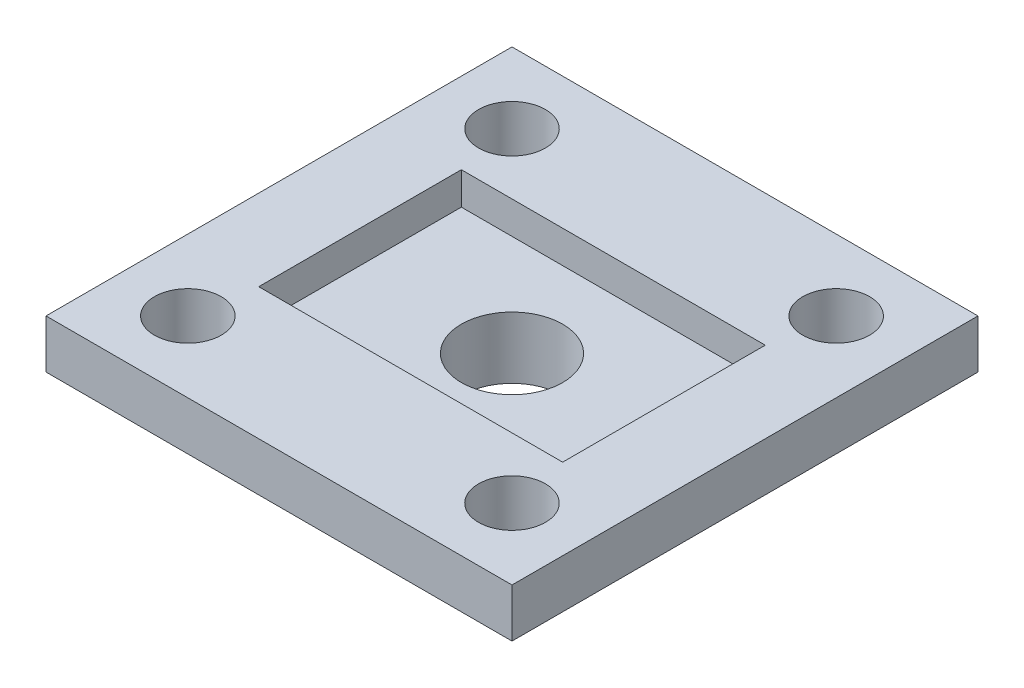
ISO-10303-21;
HEADER;
FILE_DESCRIPTION(('STEP AP214'),'2;1');
FILE_NAME('part.step','',(''),(''),'','','');
FILE_SCHEMA(('AUTOMOTIVE_DESIGN { 1 0 10303 214 1 1 1 1 }'));
ENDSEC;
DATA;
#1=APPLICATION_CONTEXT('core data for automotive mechanical design processes');
#2=APPLICATION_PROTOCOL_DEFINITION('international standard','automotive_design',2000,#1);
#3=PRODUCT_CONTEXT('',#1,'mechanical');
#4=PRODUCT('Part','Part','',(#3));
#5=PRODUCT_RELATED_PRODUCT_CATEGORY('part','',(#4));
#6=PRODUCT_DEFINITION_FORMATION('','',#4);
#7=PRODUCT_DEFINITION_CONTEXT('part definition',#1,'design');
#8=PRODUCT_DEFINITION('design','',#6,#7);
#9=PRODUCT_DEFINITION_SHAPE('','',#8);
#10=(LENGTH_UNIT() NAMED_UNIT(*) SI_UNIT(.MILLI.,.METRE.));
#11=(NAMED_UNIT(*) PLANE_ANGLE_UNIT() SI_UNIT($,.RADIAN.));
#12=(NAMED_UNIT(*) SI_UNIT($,.STERADIAN.) SOLID_ANGLE_UNIT());
#13=UNCERTAINTY_MEASURE_WITH_UNIT(LENGTH_MEASURE(1.E-05),#10,'distance_accuracy_value','');
#14=(GEOMETRIC_REPRESENTATION_CONTEXT(3) GLOBAL_UNCERTAINTY_ASSIGNED_CONTEXT((#13)) GLOBAL_UNIT_ASSIGNED_CONTEXT((#10,
#11,#12)) REPRESENTATION_CONTEXT('',''));
#15=CARTESIAN_POINT('',(0.,0.,0.));
#16=DIRECTION('',(0.,0.,1.));
#17=DIRECTION('',(1.,0.,0.));
#18=AXIS2_PLACEMENT_3D('',#15,#16,#17);
#19=CARTESIAN_POINT('',(0.,0.,0.));
#20=DIRECTION('',(0.,-1.,0.));
#21=DIRECTION('',(0.,0.,-1.));
#22=AXIS2_PLACEMENT_3D('',#19,#20,#21);
#23=PLANE('',#22);
#24=CARTESIAN_POINT('',(8.,0.,-8.00000000000001));
#25=DIRECTION('',(0.,1.,0.));
#26=DIRECTION('',(0.,0.,-1.));
#27=AXIS2_PLACEMENT_3D('',#24,#25,#26);
#28=CIRCLE('',#27,1.65);
#29=CARTESIAN_POINT('',(8.,0.,-9.65000000000001));
#30=VERTEX_POINT('',#29);
#31=EDGE_CURVE('E155',#30,#30,#28,.T.);
#32=ORIENTED_EDGE('',*,*,#31,.T.);
#33=EDGE_LOOP('',(#32));
#34=FACE_BOUND('',#33,.T.);
#35=CARTESIAN_POINT('',(8.,0.,8.));
#36=DIRECTION('',(0.,1.,0.));
#37=DIRECTION('',(0.,0.,-1.));
#38=AXIS2_PLACEMENT_3D('',#35,#36,#37);
#39=CIRCLE('',#38,1.65);
#40=CARTESIAN_POINT('',(8.,0.,6.34999999999999));
#41=VERTEX_POINT('',#40);
#42=EDGE_CURVE('E161',#41,#41,#39,.T.);
#43=ORIENTED_EDGE('',*,*,#42,.T.);
#44=EDGE_LOOP('',(#43));
#45=FACE_BOUND('',#44,.T.);
#46=DIRECTION('',(0.,0.,-1.));
#47=VECTOR('',#46,1.);
#48=CARTESIAN_POINT('',(11.5,0.,11.5));
#49=LINE('',#48,#47);
#50=CARTESIAN_POINT('',(11.5,0.,11.5));
#51=VERTEX_POINT('',#50);
#52=CARTESIAN_POINT('',(11.5,0.,-11.5));
#53=VERTEX_POINT('',#52);
#54=EDGE_CURVE('E173',#51,#53,#49,.T.);
#55=ORIENTED_EDGE('',*,*,#54,.F.);
#56=DIRECTION('',(1.,0.,0.));
#57=VECTOR('',#56,1.);
#58=CARTESIAN_POINT('',(-11.5,0.,11.5));
#59=LINE('',#58,#57);
#60=CARTESIAN_POINT('',(-11.5,0.,11.5));
#61=VERTEX_POINT('',#60);
#62=EDGE_CURVE('E79',#61,#51,#59,.T.);
#63=ORIENTED_EDGE('',*,*,#62,.F.);
#64=DIRECTION('',(0.,0.,1.));
#65=VECTOR('',#64,1.);
#66=CARTESIAN_POINT('',(-11.5,0.,11.5));
#67=LINE('',#66,#65);
#68=CARTESIAN_POINT('',(-11.5,0.,-11.5));
#69=VERTEX_POINT('',#68);
#70=EDGE_CURVE('E187',#69,#61,#67,.T.);
#71=ORIENTED_EDGE('',*,*,#70,.F.);
#72=DIRECTION('',(-1.,0.,0.));
#73=VECTOR('',#72,1.);
#74=CARTESIAN_POINT('',(-11.5,0.,-11.5));
#75=LINE('',#74,#73);
#76=EDGE_CURVE('E185',#53,#69,#75,.T.);
#77=ORIENTED_EDGE('',*,*,#76,.F.);
#78=EDGE_LOOP('',(#55,#63,#71,#77));
#79=FACE_BOUND('',#78,.T.);
#80=CARTESIAN_POINT('',(-8.,0.,-8.));
#81=DIRECTION('',(0.,1.,0.));
#82=DIRECTION('',(0.,0.,1.));
#83=AXIS2_PLACEMENT_3D('',#80,#81,#82);
#84=CIRCLE('',#83,1.65);
#85=CARTESIAN_POINT('',(-8.,0.,-6.35));
#86=VERTEX_POINT('',#85);
#87=EDGE_CURVE('E167',#86,#86,#84,.T.);
#88=ORIENTED_EDGE('',*,*,#87,.T.);
#89=EDGE_LOOP('',(#88));
#90=FACE_BOUND('',#89,.T.);
#91=CARTESIAN_POINT('',(-8.,0.,8.));
#92=DIRECTION('',(0.,1.,0.));
#93=DIRECTION('',(0.,0.,1.));
#94=AXIS2_PLACEMENT_3D('',#91,#92,#93);
#95=CIRCLE('',#94,1.65);
#96=CARTESIAN_POINT('',(-8.,0.,9.65));
#97=VERTEX_POINT('',#96);
#98=EDGE_CURVE('E154',#97,#97,#95,.T.);
#99=ORIENTED_EDGE('',*,*,#98,.T.);
#100=EDGE_LOOP('',(#99));
#101=FACE_BOUND('',#100,.T.);
#102=CARTESIAN_POINT('',(0.,0.,0.));
#103=DIRECTION('',(0.,-1.,0.));
#104=DIRECTION('',(0.,0.,-1.));
#105=AXIS2_PLACEMENT_3D('',#102,#103,#104);
#106=CIRCLE('',#105,3.5);
#107=CARTESIAN_POINT('',(0.,0.,-3.5));
#108=VERTEX_POINT('',#107);
#109=EDGE_CURVE('E135',#108,#108,#106,.T.);
#110=ORIENTED_EDGE('',*,*,#109,.F.);
#111=EDGE_LOOP('',(#110));
#112=FACE_BOUND('',#111,.T.);
#113=ADVANCED_FACE('F33',(#34,#45,#79,#90,#101,#112),#23,.T.);
#114=CARTESIAN_POINT('',(0.,2.4,0.));
#115=DIRECTION('',(0.,-1.,0.));
#116=DIRECTION('',(0.,0.,-1.));
#117=AXIS2_PLACEMENT_3D('',#114,#115,#116);
#118=PLANE('',#117);
#119=DIRECTION('',(-1.,0.,0.));
#120=VECTOR('',#119,1.);
#121=CARTESIAN_POINT('',(-7.5,2.4,-5.));
#122=LINE('',#121,#120);
#123=CARTESIAN_POINT('',(7.5,2.4,-5.));
#124=VERTEX_POINT('',#123);
#125=CARTESIAN_POINT('',(-7.5,2.4,-5.));
#126=VERTEX_POINT('',#125);
#127=EDGE_CURVE('E141',#124,#126,#122,.T.);
#128=ORIENTED_EDGE('',*,*,#127,.F.);
#129=DIRECTION('',(0.,0.,-1.));
#130=VECTOR('',#129,1.);
#131=CARTESIAN_POINT('',(7.5,2.4,5.));
#132=LINE('',#131,#130);
#133=CARTESIAN_POINT('',(7.5,2.4,5.));
#134=VERTEX_POINT('',#133);
#135=EDGE_CURVE('E49',#134,#124,#132,.T.);
#136=ORIENTED_EDGE('',*,*,#135,.F.);
#137=DIRECTION('',(1.,0.,0.));
#138=VECTOR('',#137,1.);
#139=CARTESIAN_POINT('',(-7.5,2.4,5.));
#140=LINE('',#139,#138);
#141=CARTESIAN_POINT('',(-7.5,2.4,5.));
#142=VERTEX_POINT('',#141);
#143=EDGE_CURVE('E129',#142,#134,#140,.T.);
#144=ORIENTED_EDGE('',*,*,#143,.F.);
#145=DIRECTION('',(0.,0.,1.));
#146=VECTOR('',#145,1.);
#147=CARTESIAN_POINT('',(-7.5,2.4,5.));
#148=LINE('',#147,#146);
#149=EDGE_CURVE('E132',#126,#142,#148,.T.);
#150=ORIENTED_EDGE('',*,*,#149,.F.);
#151=EDGE_LOOP('',(#128,#136,#144,#150));
#152=FACE_BOUND('',#151,.T.);
#153=DIRECTION('',(0.,0.,-1.));
#154=VECTOR('',#153,1.);
#155=CARTESIAN_POINT('',(11.5,2.4,11.5));
#156=LINE('',#155,#154);
#157=CARTESIAN_POINT('',(11.5,2.4,11.5));
#158=VERTEX_POINT('',#157);
#159=CARTESIAN_POINT('',(11.5,2.4,-11.5));
#160=VERTEX_POINT('',#159);
#161=EDGE_CURVE('E176',#158,#160,#156,.T.);
#162=ORIENTED_EDGE('',*,*,#161,.T.);
#163=DIRECTION('',(-1.,0.,0.));
#164=VECTOR('',#163,1.);
#165=CARTESIAN_POINT('',(-11.5,2.4,-11.5));
#166=LINE('',#165,#164);
#167=CARTESIAN_POINT('',(-11.5,2.4,-11.5));
#168=VERTEX_POINT('',#167);
#169=EDGE_CURVE('E86',#160,#168,#166,.T.);
#170=ORIENTED_EDGE('',*,*,#169,.T.);
#171=DIRECTION('',(0.,0.,1.));
#172=VECTOR('',#171,1.);
#173=CARTESIAN_POINT('',(-11.5,2.4,11.5));
#174=LINE('',#173,#172);
#175=CARTESIAN_POINT('',(-11.5,2.4,11.5));
#176=VERTEX_POINT('',#175);
#177=EDGE_CURVE('E179',#168,#176,#174,.T.);
#178=ORIENTED_EDGE('',*,*,#177,.T.);
#179=DIRECTION('',(1.,0.,0.));
#180=VECTOR('',#179,1.);
#181=CARTESIAN_POINT('',(-11.5,2.4,11.5));
#182=LINE('',#181,#180);
#183=EDGE_CURVE('E58',#176,#158,#182,.T.);
#184=ORIENTED_EDGE('',*,*,#183,.T.);
#185=EDGE_LOOP('',(#162,#170,#178,#184));
#186=FACE_BOUND('',#185,.T.);
#187=CARTESIAN_POINT('',(-8.,2.4,-8.));
#188=DIRECTION('',(0.,1.,0.));
#189=DIRECTION('',(0.,0.,1.));
#190=AXIS2_PLACEMENT_3D('',#187,#188,#189);
#191=CIRCLE('',#190,1.65);
#192=CARTESIAN_POINT('',(-8.,2.4,-6.35));
#193=VERTEX_POINT('',#192);
#194=EDGE_CURVE('E170',#193,#193,#191,.T.);
#195=ORIENTED_EDGE('',*,*,#194,.F.);
#196=EDGE_LOOP('',(#195));
#197=FACE_BOUND('',#196,.T.);
#198=CARTESIAN_POINT('',(8.,2.4,8.));
#199=DIRECTION('',(0.,1.,0.));
#200=DIRECTION('',(0.,0.,-1.));
#201=AXIS2_PLACEMENT_3D('',#198,#199,#200);
#202=CIRCLE('',#201,1.65);
#203=CARTESIAN_POINT('',(8.,2.4,6.34999999999999));
#204=VERTEX_POINT('',#203);
#205=EDGE_CURVE('E164',#204,#204,#202,.T.);
#206=ORIENTED_EDGE('',*,*,#205,.F.);
#207=EDGE_LOOP('',(#206));
#208=FACE_BOUND('',#207,.T.);
#209=CARTESIAN_POINT('',(-8.,2.4,8.));
#210=DIRECTION('',(0.,1.,0.));
#211=DIRECTION('',(0.,0.,1.));
#212=AXIS2_PLACEMENT_3D('',#209,#210,#211);
#213=CIRCLE('',#212,1.65);
#214=CARTESIAN_POINT('',(-8.,2.4,9.65));
#215=VERTEX_POINT('',#214);
#216=EDGE_CURVE('E158',#215,#215,#213,.T.);
#217=ORIENTED_EDGE('',*,*,#216,.F.);
#218=EDGE_LOOP('',(#217));
#219=FACE_BOUND('',#218,.T.);
#220=CARTESIAN_POINT('',(8.,2.4,-8.00000000000001));
#221=DIRECTION('',(0.,1.,0.));
#222=DIRECTION('',(0.,0.,-1.));
#223=AXIS2_PLACEMENT_3D('',#220,#221,#222);
#224=CIRCLE('',#223,1.65);
#225=CARTESIAN_POINT('',(8.,2.4,-9.65000000000001));
#226=VERTEX_POINT('',#225);
#227=EDGE_CURVE('E151',#226,#226,#224,.T.);
#228=ORIENTED_EDGE('',*,*,#227,.F.);
#229=EDGE_LOOP('',(#228));
#230=FACE_BOUND('',#229,.T.);
#231=ADVANCED_FACE('F220',(#152,#186,#197,#208,#219,#230),#118,.F.);
#232=CARTESIAN_POINT('',(11.5,2.4,11.5));
#233=DIRECTION('',(-1.,0.,0.));
#234=DIRECTION('',(0.,0.,1.));
#235=AXIS2_PLACEMENT_3D('',#232,#233,#234);
#236=PLANE('',#235);
#237=ORIENTED_EDGE('',*,*,#54,.T.);
#238=DIRECTION('',(0.,-1.,0.));
#239=VECTOR('',#238,1.);
#240=CARTESIAN_POINT('',(11.5,2.4,-11.5));
#241=LINE('',#240,#239);
#242=EDGE_CURVE('E11',#160,#53,#241,.T.);
#243=ORIENTED_EDGE('',*,*,#242,.F.);
#244=ORIENTED_EDGE('',*,*,#161,.F.);
#245=DIRECTION('',(0.,-1.,0.));
#246=VECTOR('',#245,1.);
#247=CARTESIAN_POINT('',(11.5,2.4,11.5));
#248=LINE('',#247,#246);
#249=EDGE_CURVE('E182',#158,#51,#248,.T.);
#250=ORIENTED_EDGE('',*,*,#249,.T.);
#251=EDGE_LOOP('',(#237,#243,#244,#250));
#252=FACE_BOUND('',#251,.T.);
#253=ADVANCED_FACE('F35',(#252),#236,.F.);
#254=CARTESIAN_POINT('',(-11.5,2.4,-11.5));
#255=DIRECTION('',(0.,0.,1.));
#256=DIRECTION('',(1.,0.,0.));
#257=AXIS2_PLACEMENT_3D('',#254,#255,#256);
#258=PLANE('',#257);
#259=ORIENTED_EDGE('',*,*,#76,.T.);
#260=DIRECTION('',(0.,-1.,0.));
#261=VECTOR('',#260,1.);
#262=CARTESIAN_POINT('',(-11.5,2.4,-11.5));
#263=LINE('',#262,#261);
#264=EDGE_CURVE('E42',#168,#69,#263,.T.);
#265=ORIENTED_EDGE('',*,*,#264,.F.);
#266=ORIENTED_EDGE('',*,*,#169,.F.);
#267=ORIENTED_EDGE('',*,*,#242,.T.);
#268=EDGE_LOOP('',(#259,#265,#266,#267));
#269=FACE_BOUND('',#268,.T.);
#270=ADVANCED_FACE('F216',(#269),#258,.F.);
#271=CARTESIAN_POINT('',(-11.5,2.4,11.5));
#272=DIRECTION('',(1.,0.,0.));
#273=DIRECTION('',(0.,0.,-1.));
#274=AXIS2_PLACEMENT_3D('',#271,#272,#273);
#275=PLANE('',#274);
#276=ORIENTED_EDGE('',*,*,#70,.T.);
#277=DIRECTION('',(0.,-1.,0.));
#278=VECTOR('',#277,1.);
#279=CARTESIAN_POINT('',(-11.5,2.4,11.5));
#280=LINE('',#279,#278);
#281=EDGE_CURVE('E191',#176,#61,#280,.T.);
#282=ORIENTED_EDGE('',*,*,#281,.F.);
#283=ORIENTED_EDGE('',*,*,#177,.F.);
#284=ORIENTED_EDGE('',*,*,#264,.T.);
#285=EDGE_LOOP('',(#276,#282,#283,#284));
#286=FACE_BOUND('',#285,.T.);
#287=ADVANCED_FACE('F197',(#286),#275,.F.);
#288=CARTESIAN_POINT('',(-11.5,2.4,11.5));
#289=DIRECTION('',(0.,0.,-1.));
#290=DIRECTION('',(-1.,0.,0.));
#291=AXIS2_PLACEMENT_3D('',#288,#289,#290);
#292=PLANE('',#291);
#293=ORIENTED_EDGE('',*,*,#62,.T.);
#294=ORIENTED_EDGE('',*,*,#249,.F.);
#295=ORIENTED_EDGE('',*,*,#183,.F.);
#296=ORIENTED_EDGE('',*,*,#281,.T.);
#297=EDGE_LOOP('',(#293,#294,#295,#296));
#298=FACE_BOUND('',#297,.T.);
#299=ADVANCED_FACE('F205',(#298),#292,.F.);
#300=CARTESIAN_POINT('',(-8.,2.4,-8.));
#301=DIRECTION('',(0.,-1.,0.));
#302=DIRECTION('',(0.,0.,-1.));
#303=AXIS2_PLACEMENT_3D('',#300,#301,#302);
#304=CYLINDRICAL_SURFACE('',#303,1.65);
#305=ORIENTED_EDGE('',*,*,#194,.T.);
#306=EDGE_LOOP('',(#305));
#307=FACE_BOUND('',#306,.T.);
#308=ORIENTED_EDGE('',*,*,#87,.F.);
#309=EDGE_LOOP('',(#308));
#310=FACE_BOUND('',#309,.T.);
#311=ADVANCED_FACE('F207',(#307,#310),#304,.F.);
#312=CARTESIAN_POINT('',(8.,2.4,8.));
#313=DIRECTION('',(0.,-1.,0.));
#314=DIRECTION('',(0.,0.,-1.));
#315=AXIS2_PLACEMENT_3D('',#312,#313,#314);
#316=CYLINDRICAL_SURFACE('',#315,1.65);
#317=ORIENTED_EDGE('',*,*,#205,.T.);
#318=EDGE_LOOP('',(#317));
#319=FACE_BOUND('',#318,.T.);
#320=ORIENTED_EDGE('',*,*,#42,.F.);
#321=EDGE_LOOP('',(#320));
#322=FACE_BOUND('',#321,.T.);
#323=ADVANCED_FACE('F213',(#319,#322),#316,.F.);
#324=CARTESIAN_POINT('',(-8.,2.4,8.));
#325=DIRECTION('',(0.,-1.,0.));
#326=DIRECTION('',(0.,0.,-1.));
#327=AXIS2_PLACEMENT_3D('',#324,#325,#326);
#328=CYLINDRICAL_SURFACE('',#327,1.65);
#329=ORIENTED_EDGE('',*,*,#216,.T.);
#330=EDGE_LOOP('',(#329));
#331=FACE_BOUND('',#330,.T.);
#332=ORIENTED_EDGE('',*,*,#98,.F.);
#333=EDGE_LOOP('',(#332));
#334=FACE_BOUND('',#333,.T.);
#335=ADVANCED_FACE('F231',(#331,#334),#328,.F.);
#336=CARTESIAN_POINT('',(8.,2.4,-8.00000000000001));
#337=DIRECTION('',(0.,-1.,0.));
#338=DIRECTION('',(0.,0.,-1.));
#339=AXIS2_PLACEMENT_3D('',#336,#337,#338);
#340=CYLINDRICAL_SURFACE('',#339,1.65);
#341=ORIENTED_EDGE('',*,*,#227,.T.);
#342=EDGE_LOOP('',(#341));
#343=FACE_BOUND('',#342,.T.);
#344=ORIENTED_EDGE('',*,*,#31,.F.);
#345=EDGE_LOOP('',(#344));
#346=FACE_BOUND('',#345,.T.);
#347=ADVANCED_FACE('F235',(#343,#346),#340,.F.);
#348=CARTESIAN_POINT('',(0.,-0.00100000000000013,0.));
#349=DIRECTION('',(0.,1.,0.));
#350=DIRECTION('',(0.,0.,1.));
#351=AXIS2_PLACEMENT_3D('',#348,#349,#350);
#352=CYLINDRICAL_SURFACE('',#351,2.5);
#353=CARTESIAN_POINT('',(0.,0.8,0.));
#354=DIRECTION('',(0.,-1.,0.));
#355=DIRECTION('',(0.,0.,-1.));
#356=AXIS2_PLACEMENT_3D('',#353,#354,#355);
#357=CIRCLE('',#356,2.5);
#358=CARTESIAN_POINT('',(0.,0.8,-2.5));
#359=VERTEX_POINT('',#358);
#360=EDGE_CURVE('E37',#359,#359,#357,.F.);
#361=ORIENTED_EDGE('',*,*,#360,.T.);
#362=EDGE_LOOP('',(#361));
#363=FACE_BOUND('',#362,.T.);
#364=CARTESIAN_POINT('',(0.,-2.25,0.));
#365=DIRECTION('',(0.,-1.,0.));
#366=DIRECTION('',(0.,0.,-1.));
#367=AXIS2_PLACEMENT_3D('',#364,#365,#366);
#368=CIRCLE('',#367,2.5);
#369=CARTESIAN_POINT('',(0.,-2.25,-2.5));
#370=VERTEX_POINT('',#369);
#371=EDGE_CURVE('E272',#370,#370,#368,.T.);
#372=ORIENTED_EDGE('',*,*,#371,.T.);
#373=EDGE_LOOP('',(#372));
#374=FACE_BOUND('',#373,.T.);
#375=ADVANCED_FACE('F239',(#363,#374),#352,.F.);
#376=CARTESIAN_POINT('',(0.,0.8,0.));
#377=DIRECTION('',(0.,-1.,0.));
#378=DIRECTION('',(0.,0.,-1.));
#379=AXIS2_PLACEMENT_3D('',#376,#377,#378);
#380=PLANE('',#379);
#381=DIRECTION('',(0.,0.,-1.));
#382=VECTOR('',#381,1.);
#383=CARTESIAN_POINT('',(7.5,0.8,5.));
#384=LINE('',#383,#382);
#385=CARTESIAN_POINT('',(7.5,0.8,5.));
#386=VERTEX_POINT('',#385);
#387=CARTESIAN_POINT('',(7.5,0.8,-5.));
#388=VERTEX_POINT('',#387);
#389=EDGE_CURVE('E110',#386,#388,#384,.T.);
#390=ORIENTED_EDGE('',*,*,#389,.T.);
#391=DIRECTION('',(-1.,0.,0.));
#392=VECTOR('',#391,1.);
#393=CARTESIAN_POINT('',(-7.5,0.8,-5.));
#394=LINE('',#393,#392);
#395=CARTESIAN_POINT('',(-7.5,0.8,-5.));
#396=VERTEX_POINT('',#395);
#397=EDGE_CURVE('E119',#388,#396,#394,.T.);
#398=ORIENTED_EDGE('',*,*,#397,.T.);
#399=DIRECTION('',(0.,0.,1.));
#400=VECTOR('',#399,1.);
#401=CARTESIAN_POINT('',(-7.5,0.8,5.));
#402=LINE('',#401,#400);
#403=CARTESIAN_POINT('',(-7.5,0.8,5.));
#404=VERTEX_POINT('',#403);
#405=EDGE_CURVE('E124',#396,#404,#402,.T.);
#406=ORIENTED_EDGE('',*,*,#405,.T.);
#407=DIRECTION('',(1.,0.,0.));
#408=VECTOR('',#407,1.);
#409=CARTESIAN_POINT('',(-7.5,0.8,5.));
#410=LINE('',#409,#408);
#411=EDGE_CURVE('E116',#404,#386,#410,.T.);
#412=ORIENTED_EDGE('',*,*,#411,.T.);
#413=EDGE_LOOP('',(#390,#398,#406,#412));
#414=FACE_BOUND('',#413,.T.);
#415=ORIENTED_EDGE('',*,*,#360,.F.);
#416=EDGE_LOOP('',(#415));
#417=FACE_BOUND('',#416,.T.);
#418=ADVANCED_FACE('F126',(#414,#417),#380,.F.);
#419=CARTESIAN_POINT('',(7.5,0.8,5.));
#420=DIRECTION('',(1.,0.,0.));
#421=DIRECTION('',(0.,0.,-1.));
#422=AXIS2_PLACEMENT_3D('',#419,#420,#421);
#423=PLANE('',#422);
#424=ORIENTED_EDGE('',*,*,#135,.T.);
#425=DIRECTION('',(0.,1.,0.));
#426=VECTOR('',#425,1.);
#427=CARTESIAN_POINT('',(7.5,0.8,-5.));
#428=LINE('',#427,#426);
#429=EDGE_CURVE('E106',#388,#124,#428,.T.);
#430=ORIENTED_EDGE('',*,*,#429,.F.);
#431=ORIENTED_EDGE('',*,*,#389,.F.);
#432=DIRECTION('',(0.,1.,0.));
#433=VECTOR('',#432,1.);
#434=CARTESIAN_POINT('',(7.5,0.8,5.));
#435=LINE('',#434,#433);
#436=EDGE_CURVE('E146',#386,#134,#435,.T.);
#437=ORIENTED_EDGE('',*,*,#436,.T.);
#438=EDGE_LOOP('',(#424,#430,#431,#437));
#439=FACE_BOUND('',#438,.T.);
#440=ADVANCED_FACE('F108',(#439),#423,.F.);
#441=CARTESIAN_POINT('',(-7.5,0.8,5.));
#442=DIRECTION('',(0.,0.,1.));
#443=DIRECTION('',(1.,0.,0.));
#444=AXIS2_PLACEMENT_3D('',#441,#442,#443);
#445=PLANE('',#444);
#446=ORIENTED_EDGE('',*,*,#143,.T.);
#447=ORIENTED_EDGE('',*,*,#436,.F.);
#448=ORIENTED_EDGE('',*,*,#411,.F.);
#449=DIRECTION('',(0.,1.,0.));
#450=VECTOR('',#449,1.);
#451=CARTESIAN_POINT('',(-7.5,0.8,5.));
#452=LINE('',#451,#450);
#453=EDGE_CURVE('E148',#404,#142,#452,.T.);
#454=ORIENTED_EDGE('',*,*,#453,.T.);
#455=EDGE_LOOP('',(#446,#447,#448,#454));
#456=FACE_BOUND('',#455,.T.);
#457=ADVANCED_FACE('F246',(#456),#445,.F.);
#458=CARTESIAN_POINT('',(-7.5,0.8,5.));
#459=DIRECTION('',(-1.,0.,0.));
#460=DIRECTION('',(0.,0.,1.));
#461=AXIS2_PLACEMENT_3D('',#458,#459,#460);
#462=PLANE('',#461);
#463=ORIENTED_EDGE('',*,*,#149,.T.);
#464=ORIENTED_EDGE('',*,*,#453,.F.);
#465=ORIENTED_EDGE('',*,*,#405,.F.);
#466=DIRECTION('',(0.,1.,0.));
#467=VECTOR('',#466,1.);
#468=CARTESIAN_POINT('',(-7.5,0.8,-5.));
#469=LINE('',#468,#467);
#470=EDGE_CURVE('E115',#396,#126,#469,.T.);
#471=ORIENTED_EDGE('',*,*,#470,.T.);
#472=EDGE_LOOP('',(#463,#464,#465,#471));
#473=FACE_BOUND('',#472,.T.);
#474=ADVANCED_FACE('F250',(#473),#462,.F.);
#475=CARTESIAN_POINT('',(-7.5,0.8,-5.));
#476=DIRECTION('',(0.,0.,-1.));
#477=DIRECTION('',(-1.,0.,0.));
#478=AXIS2_PLACEMENT_3D('',#475,#476,#477);
#479=PLANE('',#478);
#480=ORIENTED_EDGE('',*,*,#127,.T.);
#481=ORIENTED_EDGE('',*,*,#470,.F.);
#482=ORIENTED_EDGE('',*,*,#397,.F.);
#483=ORIENTED_EDGE('',*,*,#429,.T.);
#484=EDGE_LOOP('',(#480,#481,#482,#483));
#485=FACE_BOUND('',#484,.T.);
#486=ADVANCED_FACE('F120',(#485),#479,.F.);
#487=CARTESIAN_POINT('',(0.,-2.25,0.));
#488=DIRECTION('',(0.,-1.,0.));
#489=DIRECTION('',(0.,0.,-1.));
#490=AXIS2_PLACEMENT_3D('',#487,#488,#489);
#491=PLANE('',#490);
#492=CARTESIAN_POINT('',(0.,-2.25,0.));
#493=DIRECTION('',(0.,-1.,0.));
#494=DIRECTION('',(0.,0.,-1.));
#495=AXIS2_PLACEMENT_3D('',#492,#493,#494);
#496=CIRCLE('',#495,3.5);
#497=CARTESIAN_POINT('',(0.,-2.25,-3.5));
#498=VERTEX_POINT('',#497);
#499=EDGE_CURVE('E142',#498,#498,#496,.T.);
#500=ORIENTED_EDGE('',*,*,#499,.T.);
#501=EDGE_LOOP('',(#500));
#502=FACE_BOUND('',#501,.T.);
#503=ORIENTED_EDGE('',*,*,#371,.F.);
#504=EDGE_LOOP('',(#503));
#505=FACE_BOUND('',#504,.T.);
#506=ADVANCED_FACE('F249',(#502,#505),#491,.T.);
#507=CARTESIAN_POINT('',(0.,-2.25,0.));
#508=DIRECTION('',(0.,1.,0.));
#509=DIRECTION('',(0.,0.,1.));
#510=AXIS2_PLACEMENT_3D('',#507,#508,#509);
#511=CYLINDRICAL_SURFACE('',#510,3.5);
#512=ORIENTED_EDGE('',*,*,#499,.F.);
#513=EDGE_LOOP('',(#512));
#514=FACE_BOUND('',#513,.T.);
#515=ORIENTED_EDGE('',*,*,#109,.T.);
#516=EDGE_LOOP('',(#515));
#517=FACE_BOUND('',#516,.T.);
#518=ADVANCED_FACE('F259',(#514,#517),#511,.T.);
#519=CLOSED_SHELL('',(#113,#231,#253,#270,#287,#299,#311,#323,#335,#347,#375,#418,#440,#457,
#474,#486,#506,#518));
#520=MANIFOLD_SOLID_BREP('B2',#519);
#521=ADVANCED_BREP_SHAPE_REPRESENTATION('',(#18,#520),#14);
#522=SHAPE_DEFINITION_REPRESENTATION(#9,#521);
ENDSEC;
END-ISO-10303-21;
